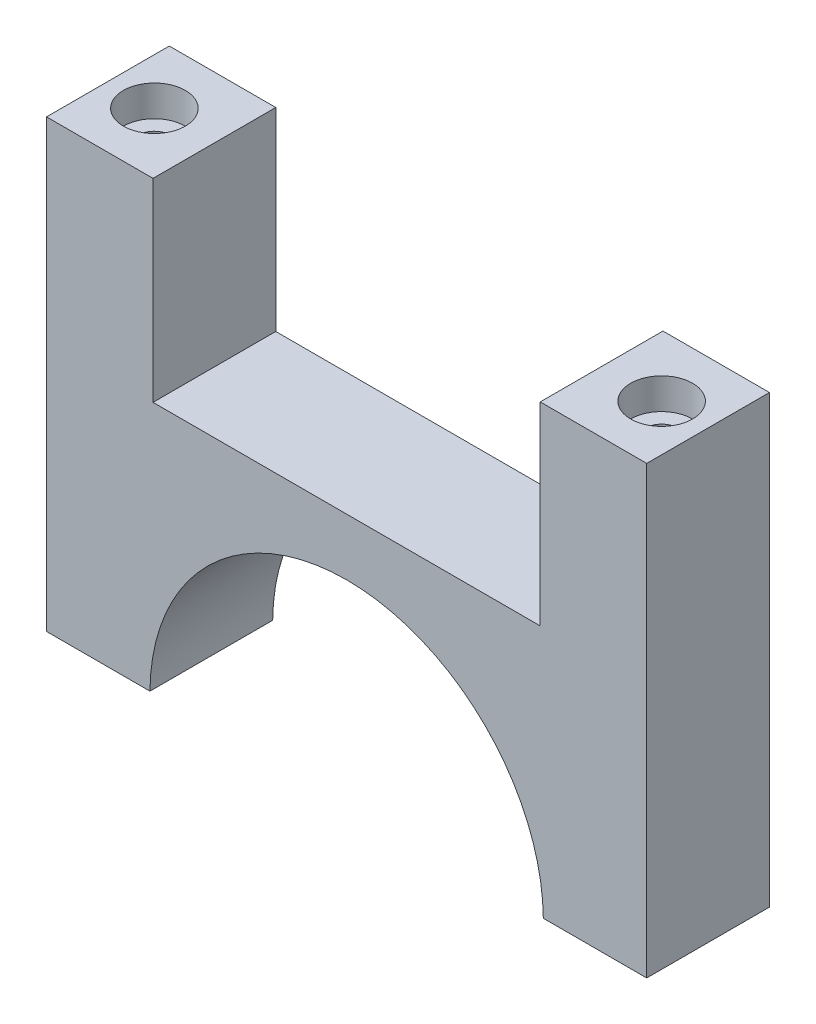
ISO-10303-21;
HEADER;
FILE_DESCRIPTION(('STEP AP214'),'2;1');
FILE_NAME('part.step','',(''),(''),'','','');
FILE_SCHEMA(('AUTOMOTIVE_DESIGN { 1 0 10303 214 1 1 1 1 }'));
ENDSEC;
DATA;
#1=APPLICATION_CONTEXT('core data for automotive mechanical design processes');
#2=APPLICATION_PROTOCOL_DEFINITION('international standard','automotive_design',2000,#1);
#3=PRODUCT_CONTEXT('',#1,'mechanical');
#4=PRODUCT('Part','Part','',(#3));
#5=PRODUCT_RELATED_PRODUCT_CATEGORY('part','',(#4));
#6=PRODUCT_DEFINITION_FORMATION('','',#4);
#7=PRODUCT_DEFINITION_CONTEXT('part definition',#1,'design');
#8=PRODUCT_DEFINITION('design','',#6,#7);
#9=PRODUCT_DEFINITION_SHAPE('','',#8);
#10=(LENGTH_UNIT() NAMED_UNIT(*) SI_UNIT(.MILLI.,.METRE.));
#11=(NAMED_UNIT(*) PLANE_ANGLE_UNIT() SI_UNIT($,.RADIAN.));
#12=(NAMED_UNIT(*) SI_UNIT($,.STERADIAN.) SOLID_ANGLE_UNIT());
#13=UNCERTAINTY_MEASURE_WITH_UNIT(LENGTH_MEASURE(1.E-05),#10,'distance_accuracy_value','');
#14=(GEOMETRIC_REPRESENTATION_CONTEXT(3) GLOBAL_UNCERTAINTY_ASSIGNED_CONTEXT((#13)) GLOBAL_UNIT_ASSIGNED_CONTEXT((#10,
#11,#12)) REPRESENTATION_CONTEXT('',''));
#15=CARTESIAN_POINT('',(0.,0.,0.));
#16=DIRECTION('',(0.,0.,1.));
#17=DIRECTION('',(1.,0.,0.));
#18=AXIS2_PLACEMENT_3D('',#15,#16,#17);
#19=CARTESIAN_POINT('',(0.,59.6605864926293,0.));
#20=DIRECTION('',(0.,0.,1.));
#21=DIRECTION('',(1.,0.,0.));
#22=AXIS2_PLACEMENT_3D('',#19,#20,#21);
#23=PLANE('',#22);
#24=CARTESIAN_POINT('',(0.,0.,0.));
#25=DIRECTION('',(0.,0.,-1.));
#26=DIRECTION('',(-0.999951561229968,-0.00984251968503953,0.));
#27=AXIS2_PLACEMENT_3D('',#24,#25,#26);
#28=CIRCLE('',#27,50.8);
#29=CARTESIAN_POINT('',(-50.7975393104823,0.500000000000008,0.));
#30=VERTEX_POINT('',#29);
#31=CARTESIAN_POINT('',(50.7975393104823,0.500000000000008,0.));
#32=VERTEX_POINT('',#31);
#33=EDGE_CURVE('E28',#30,#32,#28,.T.);
#34=ORIENTED_EDGE('',*,*,#33,.F.);
#35=DIRECTION('',(1.,0.,0.));
#36=VECTOR('',#35,1.);
#37=CARTESIAN_POINT('',(-77.5,0.5,0.));
#38=LINE('',#37,#36);
#39=CARTESIAN_POINT('',(-77.5,0.5,0.));
#40=VERTEX_POINT('',#39);
#41=EDGE_CURVE('E177',#40,#30,#38,.T.);
#42=ORIENTED_EDGE('',*,*,#41,.F.);
#43=DIRECTION('',(0.,-1.,0.));
#44=VECTOR('',#43,1.);
#45=CARTESIAN_POINT('',(-77.5,115.6,0.));
#46=LINE('',#45,#44);
#47=CARTESIAN_POINT('',(-77.5,115.6,0.));
#48=VERTEX_POINT('',#47);
#49=EDGE_CURVE('E256',#48,#40,#46,.T.);
#50=ORIENTED_EDGE('',*,*,#49,.F.);
#51=DIRECTION('',(-1.,0.,0.));
#52=VECTOR('',#51,1.);
#53=CARTESIAN_POINT('',(-50.,115.6,0.));
#54=LINE('',#53,#52);
#55=CARTESIAN_POINT('',(-50.,115.6,0.));
#56=VERTEX_POINT('',#55);
#57=EDGE_CURVE('E188',#56,#48,#54,.T.);
#58=ORIENTED_EDGE('',*,*,#57,.F.);
#59=DIRECTION('',(0.,1.,0.));
#60=VECTOR('',#59,1.);
#61=CARTESIAN_POINT('',(-50.,65.5,0.));
#62=LINE('',#61,#60);
#63=CARTESIAN_POINT('',(-50.,65.5,0.));
#64=VERTEX_POINT('',#63);
#65=EDGE_CURVE('E208',#64,#56,#62,.T.);
#66=ORIENTED_EDGE('',*,*,#65,.F.);
#67=DIRECTION('',(-1.,0.,0.));
#68=VECTOR('',#67,1.);
#69=CARTESIAN_POINT('',(50.,65.5,0.));
#70=LINE('',#69,#68);
#71=CARTESIAN_POINT('',(50.,65.5,0.));
#72=VERTEX_POINT('',#71);
#73=EDGE_CURVE('E204',#72,#64,#70,.T.);
#74=ORIENTED_EDGE('',*,*,#73,.F.);
#75=DIRECTION('',(0.,-1.,0.));
#76=VECTOR('',#75,1.);
#77=CARTESIAN_POINT('',(50.,115.6,0.));
#78=LINE('',#77,#76);
#79=CARTESIAN_POINT('',(50.,115.6,0.));
#80=VERTEX_POINT('',#79);
#81=EDGE_CURVE('E210',#80,#72,#78,.T.);
#82=ORIENTED_EDGE('',*,*,#81,.F.);
#83=DIRECTION('',(-1.,0.,0.));
#84=VECTOR('',#83,1.);
#85=CARTESIAN_POINT('',(77.5,115.6,0.));
#86=LINE('',#85,#84);
#87=CARTESIAN_POINT('',(77.5,115.6,0.));
#88=VERTEX_POINT('',#87);
#89=EDGE_CURVE('E183',#88,#80,#86,.T.);
#90=ORIENTED_EDGE('',*,*,#89,.F.);
#91=DIRECTION('',(0.,1.,0.));
#92=VECTOR('',#91,1.);
#93=CARTESIAN_POINT('',(77.5,0.5,0.));
#94=LINE('',#93,#92);
#95=CARTESIAN_POINT('',(77.5,0.5,0.));
#96=VERTEX_POINT('',#95);
#97=EDGE_CURVE('E215',#96,#88,#94,.T.);
#98=ORIENTED_EDGE('',*,*,#97,.F.);
#99=DIRECTION('',(1.,0.,0.));
#100=VECTOR('',#99,1.);
#101=CARTESIAN_POINT('',(50.7975393104823,0.500000000000008,0.));
#102=LINE('',#101,#100);
#103=EDGE_CURVE('E168',#32,#96,#102,.T.);
#104=ORIENTED_EDGE('',*,*,#103,.F.);
#105=EDGE_LOOP('',(#34,#42,#50,#58,#66,#74,#82,#90,#98,#104));
#106=FACE_BOUND('',#105,.T.);
#107=ADVANCED_FACE('F17',(#106),#23,.F.);
#108=CARTESIAN_POINT('',(0.,59.6605864926293,31.7));
#109=DIRECTION('',(0.,0.,1.));
#110=DIRECTION('',(1.,0.,0.));
#111=AXIS2_PLACEMENT_3D('',#108,#109,#110);
#112=PLANE('',#111);
#113=CARTESIAN_POINT('',(0.,0.,31.7));
#114=DIRECTION('',(0.,0.,-1.));
#115=DIRECTION('',(-0.999951561229968,-0.00984251968503953,0.));
#116=AXIS2_PLACEMENT_3D('',#113,#114,#115);
#117=CIRCLE('',#116,50.8);
#118=CARTESIAN_POINT('',(-50.7975393104823,0.500000000000008,31.7));
#119=VERTEX_POINT('',#118);
#120=CARTESIAN_POINT('',(50.7975393104823,0.500000000000008,31.7));
#121=VERTEX_POINT('',#120);
#122=EDGE_CURVE('E11',#119,#121,#117,.T.);
#123=ORIENTED_EDGE('',*,*,#122,.T.);
#124=DIRECTION('',(1.,0.,0.));
#125=VECTOR('',#124,1.);
#126=CARTESIAN_POINT('',(50.7975393104823,0.500000000000008,31.7));
#127=LINE('',#126,#125);
#128=CARTESIAN_POINT('',(77.5,0.5,31.7));
#129=VERTEX_POINT('',#128);
#130=EDGE_CURVE('E172',#121,#129,#127,.T.);
#131=ORIENTED_EDGE('',*,*,#130,.T.);
#132=DIRECTION('',(0.,1.,0.));
#133=VECTOR('',#132,1.);
#134=CARTESIAN_POINT('',(77.5,0.5,31.7));
#135=LINE('',#134,#133);
#136=CARTESIAN_POINT('',(77.5,115.6,31.7));
#137=VERTEX_POINT('',#136);
#138=EDGE_CURVE('E218',#129,#137,#135,.T.);
#139=ORIENTED_EDGE('',*,*,#138,.T.);
#140=DIRECTION('',(-1.,0.,0.));
#141=VECTOR('',#140,1.);
#142=CARTESIAN_POINT('',(77.5,115.6,31.7));
#143=LINE('',#142,#141);
#144=CARTESIAN_POINT('',(50.,115.6,31.7));
#145=VERTEX_POINT('',#144);
#146=EDGE_CURVE('E179',#137,#145,#143,.T.);
#147=ORIENTED_EDGE('',*,*,#146,.T.);
#148=DIRECTION('',(0.,-1.,0.));
#149=VECTOR('',#148,1.);
#150=CARTESIAN_POINT('',(50.,115.6,31.7));
#151=LINE('',#150,#149);
#152=CARTESIAN_POINT('',(50.,65.5,31.7));
#153=VERTEX_POINT('',#152);
#154=EDGE_CURVE('E213',#145,#153,#151,.T.);
#155=ORIENTED_EDGE('',*,*,#154,.T.);
#156=DIRECTION('',(-1.,0.,0.));
#157=VECTOR('',#156,1.);
#158=CARTESIAN_POINT('',(50.,65.5,31.7));
#159=LINE('',#158,#157);
#160=CARTESIAN_POINT('',(-50.,65.5,31.7));
#161=VERTEX_POINT('',#160);
#162=EDGE_CURVE('E21',#153,#161,#159,.T.);
#163=ORIENTED_EDGE('',*,*,#162,.T.);
#164=DIRECTION('',(0.,1.,0.));
#165=VECTOR('',#164,1.);
#166=CARTESIAN_POINT('',(-50.,65.5,31.7));
#167=LINE('',#166,#165);
#168=CARTESIAN_POINT('',(-50.,115.6,31.7));
#169=VERTEX_POINT('',#168);
#170=EDGE_CURVE('E205',#161,#169,#167,.T.);
#171=ORIENTED_EDGE('',*,*,#170,.T.);
#172=DIRECTION('',(-1.,0.,0.));
#173=VECTOR('',#172,1.);
#174=CARTESIAN_POINT('',(-50.,115.6,31.7));
#175=LINE('',#174,#173);
#176=CARTESIAN_POINT('',(-77.5,115.6,31.7));
#177=VERTEX_POINT('',#176);
#178=EDGE_CURVE('E184',#169,#177,#175,.T.);
#179=ORIENTED_EDGE('',*,*,#178,.T.);
#180=DIRECTION('',(0.,-1.,0.));
#181=VECTOR('',#180,1.);
#182=CARTESIAN_POINT('',(-77.5,115.6,31.7));
#183=LINE('',#182,#181);
#184=CARTESIAN_POINT('',(-77.5,0.5,31.7));
#185=VERTEX_POINT('',#184);
#186=EDGE_CURVE('E267',#177,#185,#183,.T.);
#187=ORIENTED_EDGE('',*,*,#186,.T.);
#188=DIRECTION('',(1.,0.,0.));
#189=VECTOR('',#188,1.);
#190=CARTESIAN_POINT('',(-77.5,0.5,31.7));
#191=LINE('',#190,#189);
#192=EDGE_CURVE('E247',#185,#119,#191,.T.);
#193=ORIENTED_EDGE('',*,*,#192,.T.);
#194=EDGE_LOOP('',(#123,#131,#139,#147,#155,#163,#171,#179,#187,#193));
#195=FACE_BOUND('',#194,.T.);
#196=ADVANCED_FACE('F287',(#195),#112,.T.);
#197=CARTESIAN_POINT('',(0.,0.,0.));
#198=DIRECTION('',(0.,0.,1.));
#199=DIRECTION('',(-0.999951561229968,-0.00984251968503953,0.));
#200=AXIS2_PLACEMENT_3D('',#197,#198,#199);
#201=CYLINDRICAL_SURFACE('',#200,50.8);
#202=ORIENTED_EDGE('',*,*,#33,.T.);
#203=DIRECTION('',(0.,0.,1.));
#204=VECTOR('',#203,1.);
#205=CARTESIAN_POINT('',(50.7975393104823,0.500000000000008,0.));
#206=LINE('',#205,#204);
#207=EDGE_CURVE('E241',#32,#121,#206,.T.);
#208=ORIENTED_EDGE('',*,*,#207,.T.);
#209=ORIENTED_EDGE('',*,*,#122,.F.);
#210=DIRECTION('',(0.,0.,1.));
#211=VECTOR('',#210,1.);
#212=CARTESIAN_POINT('',(-50.7975393104823,0.500000000000008,0.));
#213=LINE('',#212,#211);
#214=EDGE_CURVE('E230',#30,#119,#213,.T.);
#215=ORIENTED_EDGE('',*,*,#214,.F.);
#216=EDGE_LOOP('',(#202,#208,#209,#215));
#217=FACE_BOUND('',#216,.T.);
#218=ADVANCED_FACE('F294',(#217),#201,.F.);
#219=CARTESIAN_POINT('',(50.7975393104823,0.500000000000008,0.));
#220=DIRECTION('',(0.,-1.,0.));
#221=DIRECTION('',(-1.,0.,0.));
#222=AXIS2_PLACEMENT_3D('',#219,#220,#221);
#223=PLANE('',#222);
#224=CARTESIAN_POINT('',(65.5,0.500000000000007,15.85));
#225=DIRECTION('',(0.,1.,0.));
#226=DIRECTION('',(-1.,0.,0.));
#227=AXIS2_PLACEMENT_3D('',#224,#225,#226);
#228=CIRCLE('',#227,4.05);
#229=CARTESIAN_POINT('',(69.55,0.500000000000007,15.85));
#230=VERTEX_POINT('',#229);
#231=EDGE_CURVE('E159',#230,#230,#228,.T.);
#232=ORIENTED_EDGE('',*,*,#231,.T.);
#233=EDGE_LOOP('',(#232));
#234=FACE_BOUND('',#233,.T.);
#235=ORIENTED_EDGE('',*,*,#103,.T.);
#236=DIRECTION('',(0.,0.,1.));
#237=VECTOR('',#236,1.);
#238=CARTESIAN_POINT('',(77.5,0.5,0.));
#239=LINE('',#238,#237);
#240=EDGE_CURVE('E173',#96,#129,#239,.T.);
#241=ORIENTED_EDGE('',*,*,#240,.T.);
#242=ORIENTED_EDGE('',*,*,#130,.F.);
#243=ORIENTED_EDGE('',*,*,#207,.F.);
#244=EDGE_LOOP('',(#235,#241,#242,#243));
#245=FACE_BOUND('',#244,.T.);
#246=ADVANCED_FACE('F299',(#234,#245),#223,.T.);
#247=CARTESIAN_POINT('',(77.5,0.5,0.));
#248=DIRECTION('',(1.,0.,0.));
#249=DIRECTION('',(0.,-1.,0.));
#250=AXIS2_PLACEMENT_3D('',#247,#248,#249);
#251=PLANE('',#250);
#252=ORIENTED_EDGE('',*,*,#97,.T.);
#253=DIRECTION('',(0.,0.,1.));
#254=VECTOR('',#253,1.);
#255=CARTESIAN_POINT('',(77.5,115.6,0.));
#256=LINE('',#255,#254);
#257=EDGE_CURVE('E182',#88,#137,#256,.T.);
#258=ORIENTED_EDGE('',*,*,#257,.T.);
#259=ORIENTED_EDGE('',*,*,#138,.F.);
#260=ORIENTED_EDGE('',*,*,#240,.F.);
#261=EDGE_LOOP('',(#252,#258,#259,#260));
#262=FACE_BOUND('',#261,.T.);
#263=ADVANCED_FACE('F306',(#262),#251,.T.);
#264=CARTESIAN_POINT('',(77.5,115.6,0.));
#265=DIRECTION('',(0.,1.,0.));
#266=DIRECTION('',(1.,0.,0.));
#267=AXIS2_PLACEMENT_3D('',#264,#265,#266);
#268=PLANE('',#267);
#269=CARTESIAN_POINT('',(65.5,115.6,15.85));
#270=DIRECTION('',(0.,-1.,0.));
#271=DIRECTION('',(-1.,0.,0.));
#272=AXIS2_PLACEMENT_3D('',#269,#270,#271);
#273=CIRCLE('',#272,8.);
#274=CARTESIAN_POINT('',(73.5,115.6,15.85));
#275=VERTEX_POINT('',#274);
#276=EDGE_CURVE('E149',#275,#275,#273,.T.);
#277=ORIENTED_EDGE('',*,*,#276,.T.);
#278=EDGE_LOOP('',(#277));
#279=FACE_BOUND('',#278,.T.);
#280=ORIENTED_EDGE('',*,*,#89,.T.);
#281=DIRECTION('',(0.,0.,1.));
#282=VECTOR('',#281,1.);
#283=CARTESIAN_POINT('',(50.,115.6,0.));
#284=LINE('',#283,#282);
#285=EDGE_CURVE('E233',#80,#145,#284,.T.);
#286=ORIENTED_EDGE('',*,*,#285,.T.);
#287=ORIENTED_EDGE('',*,*,#146,.F.);
#288=ORIENTED_EDGE('',*,*,#257,.F.);
#289=EDGE_LOOP('',(#280,#286,#287,#288));
#290=FACE_BOUND('',#289,.T.);
#291=ADVANCED_FACE('F312',(#279,#290),#268,.T.);
#292=CARTESIAN_POINT('',(50.,115.6,0.));
#293=DIRECTION('',(-1.,0.,0.));
#294=DIRECTION('',(0.,0.,1.));
#295=AXIS2_PLACEMENT_3D('',#292,#293,#294);
#296=PLANE('',#295);
#297=ORIENTED_EDGE('',*,*,#81,.T.);
#298=DIRECTION('',(0.,0.,1.));
#299=VECTOR('',#298,1.);
#300=CARTESIAN_POINT('',(50.,65.5,0.));
#301=LINE('',#300,#299);
#302=EDGE_CURVE('E214',#72,#153,#301,.T.);
#303=ORIENTED_EDGE('',*,*,#302,.T.);
#304=ORIENTED_EDGE('',*,*,#154,.F.);
#305=ORIENTED_EDGE('',*,*,#285,.F.);
#306=EDGE_LOOP('',(#297,#303,#304,#305));
#307=FACE_BOUND('',#306,.T.);
#308=ADVANCED_FACE('F318',(#307),#296,.T.);
#309=CARTESIAN_POINT('',(50.,65.5,0.));
#310=DIRECTION('',(0.,1.,0.));
#311=DIRECTION('',(1.,0.,0.));
#312=AXIS2_PLACEMENT_3D('',#309,#310,#311);
#313=PLANE('',#312);
#314=ORIENTED_EDGE('',*,*,#73,.T.);
#315=DIRECTION('',(0.,0.,1.));
#316=VECTOR('',#315,1.);
#317=CARTESIAN_POINT('',(-50.,65.5,0.));
#318=LINE('',#317,#316);
#319=EDGE_CURVE('E200',#64,#161,#318,.T.);
#320=ORIENTED_EDGE('',*,*,#319,.T.);
#321=ORIENTED_EDGE('',*,*,#162,.F.);
#322=ORIENTED_EDGE('',*,*,#302,.F.);
#323=EDGE_LOOP('',(#314,#320,#321,#322));
#324=FACE_BOUND('',#323,.T.);
#325=ADVANCED_FACE('F348',(#324),#313,.T.);
#326=CARTESIAN_POINT('',(-50.,65.5,0.));
#327=DIRECTION('',(1.,0.,0.));
#328=DIRECTION('',(0.,1.,0.));
#329=AXIS2_PLACEMENT_3D('',#326,#327,#328);
#330=PLANE('',#329);
#331=ORIENTED_EDGE('',*,*,#65,.T.);
#332=DIRECTION('',(0.,0.,1.));
#333=VECTOR('',#332,1.);
#334=CARTESIAN_POINT('',(-50.,115.6,0.));
#335=LINE('',#334,#333);
#336=EDGE_CURVE('E187',#56,#169,#335,.T.);
#337=ORIENTED_EDGE('',*,*,#336,.T.);
#338=ORIENTED_EDGE('',*,*,#170,.F.);
#339=ORIENTED_EDGE('',*,*,#319,.F.);
#340=EDGE_LOOP('',(#331,#337,#338,#339));
#341=FACE_BOUND('',#340,.T.);
#342=ADVANCED_FACE('F334',(#341),#330,.T.);
#343=CARTESIAN_POINT('',(-50.,115.6,0.));
#344=DIRECTION('',(0.,1.,0.));
#345=DIRECTION('',(1.,0.,0.));
#346=AXIS2_PLACEMENT_3D('',#343,#344,#345);
#347=PLANE('',#346);
#348=CARTESIAN_POINT('',(-65.5,115.6,15.85));
#349=DIRECTION('',(0.,-1.,0.));
#350=DIRECTION('',(1.,0.,0.));
#351=AXIS2_PLACEMENT_3D('',#348,#349,#350);
#352=CIRCLE('',#351,8.);
#353=CARTESIAN_POINT('',(-73.5,115.6,15.85));
#354=VERTEX_POINT('',#353);
#355=EDGE_CURVE('E191',#354,#354,#352,.T.);
#356=ORIENTED_EDGE('',*,*,#355,.T.);
#357=EDGE_LOOP('',(#356));
#358=FACE_BOUND('',#357,.T.);
#359=ORIENTED_EDGE('',*,*,#57,.T.);
#360=DIRECTION('',(0.,0.,1.));
#361=VECTOR('',#360,1.);
#362=CARTESIAN_POINT('',(-77.5,115.6,0.));
#363=LINE('',#362,#361);
#364=EDGE_CURVE('E258',#48,#177,#363,.T.);
#365=ORIENTED_EDGE('',*,*,#364,.T.);
#366=ORIENTED_EDGE('',*,*,#178,.F.);
#367=ORIENTED_EDGE('',*,*,#336,.F.);
#368=EDGE_LOOP('',(#359,#365,#366,#367));
#369=FACE_BOUND('',#368,.T.);
#370=ADVANCED_FACE('F336',(#358,#369),#347,.T.);
#371=CARTESIAN_POINT('',(-77.5,115.6,0.));
#372=DIRECTION('',(-1.,0.,0.));
#373=DIRECTION('',(0.,0.,1.));
#374=AXIS2_PLACEMENT_3D('',#371,#372,#373);
#375=PLANE('',#374);
#376=ORIENTED_EDGE('',*,*,#49,.T.);
#377=DIRECTION('',(0.,0.,1.));
#378=VECTOR('',#377,1.);
#379=CARTESIAN_POINT('',(-77.5,0.5,0.));
#380=LINE('',#379,#378);
#381=EDGE_CURVE('E253',#40,#185,#380,.T.);
#382=ORIENTED_EDGE('',*,*,#381,.T.);
#383=ORIENTED_EDGE('',*,*,#186,.F.);
#384=ORIENTED_EDGE('',*,*,#364,.F.);
#385=EDGE_LOOP('',(#376,#382,#383,#384));
#386=FACE_BOUND('',#385,.T.);
#387=ADVANCED_FACE('F338',(#386),#375,.T.);
#388=CARTESIAN_POINT('',(-77.5,0.5,0.));
#389=DIRECTION('',(0.,-1.,0.));
#390=DIRECTION('',(0.,0.,-1.));
#391=AXIS2_PLACEMENT_3D('',#388,#389,#390);
#392=PLANE('',#391);
#393=CARTESIAN_POINT('',(-65.5,0.500000000000007,15.85));
#394=DIRECTION('',(0.,1.,0.));
#395=DIRECTION('',(1.,0.,0.));
#396=AXIS2_PLACEMENT_3D('',#393,#394,#395);
#397=CIRCLE('',#396,4.05);
#398=CARTESIAN_POINT('',(-69.55,0.500000000000007,15.85));
#399=VERTEX_POINT('',#398);
#400=EDGE_CURVE('E174',#399,#399,#397,.T.);
#401=ORIENTED_EDGE('',*,*,#400,.T.);
#402=EDGE_LOOP('',(#401));
#403=FACE_BOUND('',#402,.T.);
#404=ORIENTED_EDGE('',*,*,#41,.T.);
#405=ORIENTED_EDGE('',*,*,#214,.T.);
#406=ORIENTED_EDGE('',*,*,#192,.F.);
#407=ORIENTED_EDGE('',*,*,#381,.F.);
#408=EDGE_LOOP('',(#404,#405,#406,#407));
#409=FACE_BOUND('',#408,.T.);
#410=ADVANCED_FACE('F291',(#403,#409),#392,.T.);
#411=CARTESIAN_POINT('',(-65.5,-80.0473868979599,15.85));
#412=DIRECTION('',(0.,1.,0.));
#413=DIRECTION('',(1.,0.,0.));
#414=AXIS2_PLACEMENT_3D('',#411,#412,#413);
#415=CYLINDRICAL_SURFACE('',#414,4.05);
#416=CARTESIAN_POINT('',(-65.5,107.6,15.85));
#417=DIRECTION('',(0.,1.,0.));
#418=DIRECTION('',(1.,0.,0.));
#419=AXIS2_PLACEMENT_3D('',#416,#417,#418);
#420=CIRCLE('',#419,4.05);
#421=CARTESIAN_POINT('',(-69.55,107.6,15.85));
#422=VERTEX_POINT('',#421);
#423=EDGE_CURVE('E196',#422,#422,#420,.T.);
#424=ORIENTED_EDGE('',*,*,#423,.T.);
#425=DIRECTION('',(0.,-1.,0.));
#426=VECTOR('',#425,1.);
#427=CARTESIAN_POINT('',(-69.55,-80.0473868979599,15.85));
#428=LINE('',#427,#426);
#429=EDGE_CURVE('E178',#422,#399,#428,.T.);
#430=ORIENTED_EDGE('',*,*,#429,.T.);
#431=ORIENTED_EDGE('',*,*,#400,.F.);
#432=ORIENTED_EDGE('',*,*,#429,.F.);
#433=EDGE_LOOP('',(#424,#430,#431,#432));
#434=FACE_BOUND('',#433,.T.);
#435=ADVANCED_FACE('F371',(#434),#415,.F.);
#436=CARTESIAN_POINT('',(-65.5,111.6,15.85));
#437=DIRECTION('',(0.,1.,0.));
#438=DIRECTION('',(1.,0.,0.));
#439=AXIS2_PLACEMENT_3D('',#436,#437,#438);
#440=CYLINDRICAL_SURFACE('',#439,8.);
#441=ORIENTED_EDGE('',*,*,#355,.F.);
#442=DIRECTION('',(0.,-1.,0.));
#443=VECTOR('',#442,1.);
#444=CARTESIAN_POINT('',(-73.5,111.6,15.85));
#445=LINE('',#444,#443);
#446=CARTESIAN_POINT('',(-73.5,107.6,15.85));
#447=VERTEX_POINT('',#446);
#448=EDGE_CURVE('E195',#354,#447,#445,.T.);
#449=ORIENTED_EDGE('',*,*,#448,.T.);
#450=CARTESIAN_POINT('',(-65.5,107.6,15.85));
#451=DIRECTION('',(0.,1.,0.));
#452=DIRECTION('',(1.,0.,0.));
#453=AXIS2_PLACEMENT_3D('',#450,#451,#452);
#454=CIRCLE('',#453,8.);
#455=EDGE_CURVE('E167',#447,#447,#454,.T.);
#456=ORIENTED_EDGE('',*,*,#455,.F.);
#457=ORIENTED_EDGE('',*,*,#448,.F.);
#458=EDGE_LOOP('',(#441,#449,#456,#457));
#459=FACE_BOUND('',#458,.T.);
#460=ADVANCED_FACE('F19',(#459),#440,.F.);
#461=CARTESIAN_POINT('',(-65.5,107.6,15.85));
#462=DIRECTION('',(0.,1.,0.));
#463=DIRECTION('',(1.,0.,0.));
#464=AXIS2_PLACEMENT_3D('',#461,#462,#463);
#465=PLANE('',#464);
#466=ORIENTED_EDGE('',*,*,#423,.F.);
#467=EDGE_LOOP('',(#466));
#468=FACE_BOUND('',#467,.T.);
#469=ORIENTED_EDGE('',*,*,#455,.T.);
#470=EDGE_LOOP('',(#469));
#471=FACE_BOUND('',#470,.T.);
#472=ADVANCED_FACE('F375',(#468,#471),#465,.T.);
#473=CARTESIAN_POINT('',(65.5,-80.0473868979599,15.85));
#474=DIRECTION('',(0.,-1.,0.));
#475=DIRECTION('',(-1.,0.,0.));
#476=AXIS2_PLACEMENT_3D('',#473,#474,#475);
#477=CYLINDRICAL_SURFACE('',#476,4.05);
#478=CARTESIAN_POINT('',(65.5,107.6,15.85));
#479=DIRECTION('',(0.,-1.,0.));
#480=DIRECTION('',(-1.,0.,0.));
#481=AXIS2_PLACEMENT_3D('',#478,#479,#480);
#482=CIRCLE('',#481,4.05);
#483=CARTESIAN_POINT('',(69.55,107.6,15.85));
#484=VERTEX_POINT('',#483);
#485=EDGE_CURVE('E161',#484,#484,#482,.T.);
#486=ORIENTED_EDGE('',*,*,#485,.F.);
#487=DIRECTION('',(0.,-1.,0.));
#488=VECTOR('',#487,1.);
#489=CARTESIAN_POINT('',(69.55,-80.0473868979599,15.85));
#490=LINE('',#489,#488);
#491=EDGE_CURVE('E151',#484,#230,#490,.T.);
#492=ORIENTED_EDGE('',*,*,#491,.T.);
#493=ORIENTED_EDGE('',*,*,#231,.F.);
#494=ORIENTED_EDGE('',*,*,#491,.F.);
#495=EDGE_LOOP('',(#486,#492,#493,#494));
#496=FACE_BOUND('',#495,.T.);
#497=ADVANCED_FACE('F361',(#496),#477,.F.);
#498=CARTESIAN_POINT('',(65.5,111.6,15.85));
#499=DIRECTION('',(0.,-1.,0.));
#500=DIRECTION('',(-1.,0.,0.));
#501=AXIS2_PLACEMENT_3D('',#498,#499,#500);
#502=CYLINDRICAL_SURFACE('',#501,8.);
#503=ORIENTED_EDGE('',*,*,#276,.F.);
#504=DIRECTION('',(0.,-1.,0.));
#505=VECTOR('',#504,1.);
#506=CARTESIAN_POINT('',(73.5,111.6,15.85));
#507=LINE('',#506,#505);
#508=CARTESIAN_POINT('',(73.5,107.6,15.85));
#509=VERTEX_POINT('',#508);
#510=EDGE_CURVE('E144',#275,#509,#507,.T.);
#511=ORIENTED_EDGE('',*,*,#510,.T.);
#512=CARTESIAN_POINT('',(65.5,107.6,15.85));
#513=DIRECTION('',(0.,-1.,0.));
#514=DIRECTION('',(-1.,0.,0.));
#515=AXIS2_PLACEMENT_3D('',#512,#513,#514);
#516=CIRCLE('',#515,8.);
#517=EDGE_CURVE('E147',#509,#509,#516,.T.);
#518=ORIENTED_EDGE('',*,*,#517,.T.);
#519=ORIENTED_EDGE('',*,*,#510,.F.);
#520=EDGE_LOOP('',(#503,#511,#518,#519));
#521=FACE_BOUND('',#520,.T.);
#522=ADVANCED_FACE('F145',(#521),#502,.F.);
#523=CARTESIAN_POINT('',(65.5,107.6,15.85));
#524=DIRECTION('',(0.,-1.,0.));
#525=DIRECTION('',(0.,0.,-1.));
#526=AXIS2_PLACEMENT_3D('',#523,#524,#525);
#527=PLANE('',#526);
#528=ORIENTED_EDGE('',*,*,#485,.T.);
#529=EDGE_LOOP('',(#528));
#530=FACE_BOUND('',#529,.T.);
#531=ORIENTED_EDGE('',*,*,#517,.F.);
#532=EDGE_LOOP('',(#531));
#533=FACE_BOUND('',#532,.T.);
#534=ADVANCED_FACE('F364',(#530,#533),#527,.F.);
#535=CLOSED_SHELL('',(#107,#196,#218,#246,#263,#291,#308,#325,#342,#370,#387,#410,#435,#460,
#472,#497,#522,#534));
#536=MANIFOLD_SOLID_BREP('B1',#535);
#537=ADVANCED_BREP_SHAPE_REPRESENTATION('',(#18,#536),#14);
#538=SHAPE_DEFINITION_REPRESENTATION(#9,#537);
ENDSEC;
END-ISO-10303-21;
